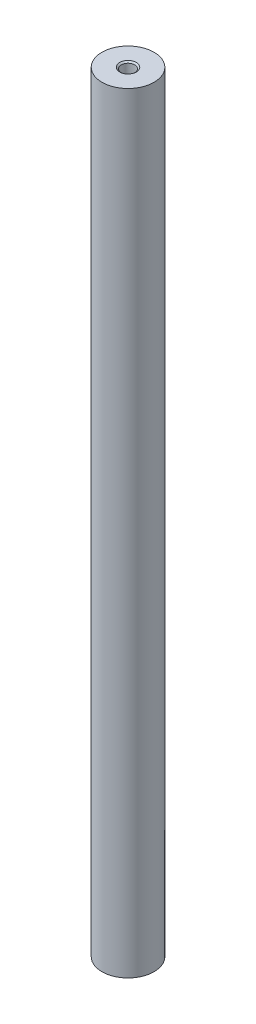
ISO-10303-21;
HEADER;
FILE_DESCRIPTION(('STEP AP214'),'2;1');
FILE_NAME('part.step','',(''),(''),'','','');
FILE_SCHEMA(('AUTOMOTIVE_DESIGN { 1 0 10303 214 1 1 1 1 }'));
ENDSEC;
DATA;
#1=APPLICATION_CONTEXT('core data for automotive mechanical design processes');
#2=APPLICATION_PROTOCOL_DEFINITION('international standard','automotive_design',2000,#1);
#3=PRODUCT_CONTEXT('',#1,'mechanical');
#4=PRODUCT('Part','Part','',(#3));
#5=PRODUCT_RELATED_PRODUCT_CATEGORY('part','',(#4));
#6=PRODUCT_DEFINITION_FORMATION('','',#4);
#7=PRODUCT_DEFINITION_CONTEXT('part definition',#1,'design');
#8=PRODUCT_DEFINITION('design','',#6,#7);
#9=PRODUCT_DEFINITION_SHAPE('','',#8);
#10=(LENGTH_UNIT() NAMED_UNIT(*) SI_UNIT(.MILLI.,.METRE.));
#11=(NAMED_UNIT(*) PLANE_ANGLE_UNIT() SI_UNIT($,.RADIAN.));
#12=(NAMED_UNIT(*) SI_UNIT($,.STERADIAN.) SOLID_ANGLE_UNIT());
#13=UNCERTAINTY_MEASURE_WITH_UNIT(LENGTH_MEASURE(1.E-05),#10,'distance_accuracy_value','');
#14=(GEOMETRIC_REPRESENTATION_CONTEXT(3) GLOBAL_UNCERTAINTY_ASSIGNED_CONTEXT((#13)) GLOBAL_UNIT_ASSIGNED_CONTEXT((#10,
#11,#12)) REPRESENTATION_CONTEXT('',''));
#15=CARTESIAN_POINT('',(0.,0.,0.));
#16=DIRECTION('',(0.,0.,1.));
#17=DIRECTION('',(1.,0.,0.));
#18=AXIS2_PLACEMENT_3D('',#15,#16,#17);
#19=CARTESIAN_POINT('',(0.,187.8203,0.));
#20=DIRECTION('',(0.,-1.,0.));
#21=DIRECTION('',(0.,0.,-1.));
#22=AXIS2_PLACEMENT_3D('',#19,#20,#21);
#23=CYLINDRICAL_SURFACE('',#22,6.35);
#24=CARTESIAN_POINT('',(0.,187.8203,0.));
#25=DIRECTION('',(0.,1.,0.));
#26=DIRECTION('',(0.,0.,1.));
#27=AXIS2_PLACEMENT_3D('',#24,#25,#26);
#28=CIRCLE('',#27,6.35);
#29=CARTESIAN_POINT('',(0.,187.8203,-6.35));
#30=VERTEX_POINT('',#29);
#31=EDGE_CURVE('E11',#30,#30,#28,.T.);
#32=CARTESIAN_POINT('',(0.,0.,0.));
#33=DIRECTION('',(0.,1.,0.));
#34=DIRECTION('',(0.,0.,1.));
#35=AXIS2_PLACEMENT_3D('',#32,#33,#34);
#36=CIRCLE('',#35,6.35);
#37=CARTESIAN_POINT('',(0.,0.,-6.35));
#38=VERTEX_POINT('',#37);
#39=EDGE_CURVE('E50',#38,#38,#36,.T.);
#40=CARTESIAN_POINT('',(0.,187.8203,-6.35));
#41=CARTESIAN_POINT('',(0.,185.863838541667,-6.35));
#42=CARTESIAN_POINT('',(0.,183.907377083333,-6.35));
#43=CARTESIAN_POINT('',(0.,179.994454166667,-6.35));
#44=CARTESIAN_POINT('',(0.,178.037992708333,-6.35));
#45=CARTESIAN_POINT('',(0.,174.125069791667,-6.35));
#46=CARTESIAN_POINT('',(0.,172.168608333333,-6.35));
#47=CARTESIAN_POINT('',(0.,168.255685416667,-6.35));
#48=CARTESIAN_POINT('',(0.,166.299223958333,-6.35));
#49=CARTESIAN_POINT('',(0.,162.386301041667,-6.35));
#50=CARTESIAN_POINT('',(0.,160.429839583333,-6.35));
#51=CARTESIAN_POINT('',(0.,156.516916666667,-6.35));
#52=CARTESIAN_POINT('',(0.,154.560455208333,-6.35));
#53=CARTESIAN_POINT('',(0.,150.647532291667,-6.35));
#54=CARTESIAN_POINT('',(0.,148.691070833333,-6.35));
#55=CARTESIAN_POINT('',(0.,144.778147916667,-6.35));
#56=CARTESIAN_POINT('',(0.,142.821686458333,-6.35));
#57=CARTESIAN_POINT('',(0.,138.908763541667,-6.35));
#58=CARTESIAN_POINT('',(0.,136.952302083333,-6.35));
#59=CARTESIAN_POINT('',(0.,133.039379166667,-6.35));
#60=CARTESIAN_POINT('',(0.,131.082917708333,-6.35));
#61=CARTESIAN_POINT('',(0.,127.169994791667,-6.35));
#62=CARTESIAN_POINT('',(0.,125.213533333333,-6.35));
#63=CARTESIAN_POINT('',(0.,121.300610416667,-6.35));
#64=CARTESIAN_POINT('',(0.,119.344148958333,-6.35));
#65=CARTESIAN_POINT('',(0.,115.431226041667,-6.35));
#66=CARTESIAN_POINT('',(0.,113.474764583333,-6.35));
#67=CARTESIAN_POINT('',(0.,109.561841666667,-6.35));
#68=CARTESIAN_POINT('',(0.,107.605380208333,-6.35));
#69=CARTESIAN_POINT('',(0.,103.692457291667,-6.35));
#70=CARTESIAN_POINT('',(0.,101.735995833333,-6.35));
#71=CARTESIAN_POINT('',(0.,97.8230729166666,-6.35));
#72=CARTESIAN_POINT('',(0.,95.8666114583333,-6.35));
#73=CARTESIAN_POINT('',(0.,91.9536885416667,-6.35));
#74=CARTESIAN_POINT('',(0.,89.9972270833333,-6.35));
#75=CARTESIAN_POINT('',(0.,86.0843041666667,-6.35));
#76=CARTESIAN_POINT('',(0.,84.1278427083333,-6.35));
#77=CARTESIAN_POINT('',(0.,80.2149197916666,-6.35));
#78=CARTESIAN_POINT('',(0.,78.2584583333333,-6.35));
#79=CARTESIAN_POINT('',(0.,74.3455354166666,-6.35));
#80=CARTESIAN_POINT('',(0.,72.3890739583333,-6.35));
#81=CARTESIAN_POINT('',(0.,68.4761510416666,-6.35));
#82=CARTESIAN_POINT('',(0.,66.5196895833333,-6.35));
#83=CARTESIAN_POINT('',(0.,62.6067666666666,-6.35));
#84=CARTESIAN_POINT('',(0.,60.6503052083333,-6.35));
#85=CARTESIAN_POINT('',(0.,56.7373822916666,-6.35));
#86=CARTESIAN_POINT('',(0.,54.7809208333333,-6.35));
#87=CARTESIAN_POINT('',(0.,50.8679979166666,-6.35));
#88=CARTESIAN_POINT('',(0.,48.9115364583333,-6.35));
#89=CARTESIAN_POINT('',(0.,44.9986135416666,-6.35));
#90=CARTESIAN_POINT('',(0.,43.0421520833333,-6.35));
#91=CARTESIAN_POINT('',(0.,39.1292291666666,-6.35));
#92=CARTESIAN_POINT('',(0.,37.1727677083333,-6.35));
#93=CARTESIAN_POINT('',(0.,33.2598447916666,-6.35));
#94=CARTESIAN_POINT('',(0.,31.3033833333333,-6.35));
#95=CARTESIAN_POINT('',(0.,27.3904604166667,-6.35));
#96=CARTESIAN_POINT('',(0.,25.4339989583333,-6.35));
#97=CARTESIAN_POINT('',(0.,21.5210760416666,-6.35));
#98=CARTESIAN_POINT('',(0.,19.5646145833333,-6.35));
#99=CARTESIAN_POINT('',(0.,15.6516916666666,-6.35));
#100=CARTESIAN_POINT('',(0.,13.6952302083333,-6.35));
#101=CARTESIAN_POINT('',(0.,9.78230729166663,-6.35));
#102=CARTESIAN_POINT('',(0.,7.82584583333331,-6.35));
#103=CARTESIAN_POINT('',(0.,3.91292291666664,-6.35));
#104=CARTESIAN_POINT('',(0.,1.95646145833331,-6.35));
#105=CARTESIAN_POINT('',(0.,0.,-6.35));
#106=B_SPLINE_CURVE_WITH_KNOTS('',3,(#40,#41,#42,#43,#44,#45,#46,#47,#48,#49,#50,#51,#52,#53,
#54,#55,#56,#57,#58,#59,#60,#61,#62,#63,#64,#65,#66,#67,#68,#69,#70,#71,#72,#73,#74,#75,#76,#77,
#78,#79,#80,#81,#82,#83,#84,#85,#86,#87,#88,#89,#90,#91,#92,#93,#94,#95,#96,#97,#98,#99,#100,
#101,#102,#103,#104,#105),.UNSPECIFIED.,.F.,.F.,(4,2,2,2,2,2,2,2,2,2,2,2,2,2,2,2,2,2,2,2,2,2,2,
2,2,2,2,2,2,2,2,2,4),(0.,5.86938437499998,11.73876875,17.608153125,23.4775375,29.346921875,
35.21630625,41.085690625,46.955075,52.824459375,58.69384375,64.563228125,70.4326125,
76.301996875,82.17138125,88.040765625,93.91015,99.779534375,105.64891875,111.518303125,
117.3876875,123.257071875,129.12645625,134.995840625,140.865225,146.734609375,152.60399375,
158.473378125,164.3427625,170.212146875,176.08153125,181.950915625,187.8203),.UNSPECIFIED.);
#107=EDGE_CURVE('BSEAM47',#30,#38,#106,.T.);
#108=ORIENTED_EDGE('',*,*,#31,.F.);
#109=ORIENTED_EDGE('',*,*,#39,.T.);
#110=ORIENTED_EDGE('',*,*,#107,.T.);
#111=ORIENTED_EDGE('',*,*,#107,.F.);
#112=EDGE_LOOP('',(#108,#110,#109,#111));
#113=FACE_BOUND('',#112,.T.);
#114=ADVANCED_FACE('F47',(#113),#23,.T.);
#115=CARTESIAN_POINT('',(0.,187.8203,0.));
#116=DIRECTION('',(0.,1.,0.));
#117=DIRECTION('',(0.,0.,1.));
#118=AXIS2_PLACEMENT_3D('',#115,#116,#117);
#119=PLANE('',#118);
#120=CARTESIAN_POINT('',(0.,187.8203,0.));
#121=DIRECTION('',(0.,1.,0.));
#122=DIRECTION('',(0.,0.,1.));
#123=AXIS2_PLACEMENT_3D('',#120,#121,#122);
#124=CIRCLE('',#123,2.025);
#125=CARTESIAN_POINT('',(0.,187.8203,2.025));
#126=VERTEX_POINT('',#125);
#127=EDGE_CURVE('E81',#126,#126,#124,.T.);
#128=ORIENTED_EDGE('',*,*,#127,.F.);
#129=EDGE_LOOP('',(#128));
#130=FACE_BOUND('',#129,.T.);
#131=ORIENTED_EDGE('',*,*,#31,.T.);
#132=EDGE_LOOP('',(#131));
#133=FACE_BOUND('',#132,.T.);
#134=ADVANCED_FACE('F101',(#130,#133),#119,.T.);
#135=CARTESIAN_POINT('',(0.,0.,0.));
#136=DIRECTION('',(0.,1.,0.));
#137=DIRECTION('',(0.,0.,1.));
#138=AXIS2_PLACEMENT_3D('',#135,#136,#137);
#139=PLANE('',#138);
#140=CARTESIAN_POINT('',(0.,0.,0.));
#141=DIRECTION('',(0.,-1.,0.));
#142=DIRECTION('',(0.,0.,-1.));
#143=AXIS2_PLACEMENT_3D('',#140,#141,#142);
#144=CIRCLE('',#143,3.81);
#145=CARTESIAN_POINT('',(0.,0.,-3.81));
#146=VERTEX_POINT('',#145);
#147=EDGE_CURVE('E72',#146,#146,#144,.T.);
#148=ORIENTED_EDGE('',*,*,#147,.F.);
#149=EDGE_LOOP('',(#148));
#150=FACE_BOUND('',#149,.T.);
#151=ORIENTED_EDGE('',*,*,#39,.F.);
#152=EDGE_LOOP('',(#151));
#153=FACE_BOUND('',#152,.T.);
#154=ADVANCED_FACE('F98',(#150,#153),#139,.F.);
#155=CARTESIAN_POINT('',(0.,21.59,0.));
#156=DIRECTION('',(0.,-1.,0.));
#157=DIRECTION('',(0.,0.,-1.));
#158=AXIS2_PLACEMENT_3D('',#155,#156,#157);
#159=CONICAL_SURFACE('',#158,2.55269999999999,1.02974425867665);
#160=CARTESIAN_POINT('',(0.,23.1238169021917,0.));
#161=VERTEX_POINT('',#160);
#162=VERTEX_LOOP('',#161);
#163=FACE_BOUND('',#162,.T.);
#164=CARTESIAN_POINT('',(0.,21.59,0.));
#165=DIRECTION('',(0.,-1.,0.));
#166=DIRECTION('',(0.,0.,-1.));
#167=AXIS2_PLACEMENT_3D('',#164,#165,#166);
#168=CIRCLE('',#167,2.55269999999999);
#169=CARTESIAN_POINT('',(0.,21.59,-2.55269999999999));
#170=VERTEX_POINT('',#169);
#171=EDGE_CURVE('E88',#170,#170,#168,.T.);
#172=ORIENTED_EDGE('',*,*,#171,.T.);
#173=EDGE_LOOP('',(#172));
#174=FACE_BOUND('',#173,.T.);
#175=ADVANCED_FACE('F100',(#163,#174),#159,.F.);
#176=CARTESIAN_POINT('',(0.,0.,0.));
#177=DIRECTION('',(0.,-1.,0.));
#178=DIRECTION('',(0.,0.,-1.));
#179=AXIS2_PLACEMENT_3D('',#176,#177,#178);
#180=CYLINDRICAL_SURFACE('',#179,2.5527);
#181=ORIENTED_EDGE('',*,*,#171,.F.);
#182=EDGE_LOOP('',(#181));
#183=FACE_BOUND('',#182,.T.);
#184=CARTESIAN_POINT('',(0.,1.05499996627919,0.));
#185=DIRECTION('',(0.,-1.,0.));
#186=DIRECTION('',(0.,0.,-1.));
#187=AXIS2_PLACEMENT_3D('',#184,#185,#186);
#188=CIRCLE('',#187,2.5527);
#189=CARTESIAN_POINT('',(0.,1.05499996627919,-2.5527));
#190=VERTEX_POINT('',#189);
#191=EDGE_CURVE('E78',#190,#190,#188,.T.);
#192=ORIENTED_EDGE('',*,*,#191,.T.);
#193=EDGE_LOOP('',(#192));
#194=FACE_BOUND('',#193,.T.);
#195=ADVANCED_FACE('F107',(#183,#194),#180,.F.);
#196=CARTESIAN_POINT('',(0.,0.,0.));
#197=DIRECTION('',(0.,-1.,0.));
#198=DIRECTION('',(0.,0.,-1.));
#199=AXIS2_PLACEMENT_3D('',#196,#197,#198);
#200=CONICAL_SURFACE('',#199,3.81,0.872664625997165);
#201=ORIENTED_EDGE('',*,*,#191,.F.);
#202=EDGE_LOOP('',(#201));
#203=FACE_BOUND('',#202,.T.);
#204=ORIENTED_EDGE('',*,*,#147,.T.);
#205=EDGE_LOOP('',(#204));
#206=FACE_BOUND('',#205,.T.);
#207=ADVANCED_FACE('F65',(#203,#206),#200,.F.);
#208=CARTESIAN_POINT('',(0.,170.0911,0.));
#209=DIRECTION('',(0.,1.,0.));
#210=DIRECTION('',(0.,0.,1.));
#211=AXIS2_PLACEMENT_3D('',#208,#209,#210);
#212=CONICAL_SURFACE('',#211,1.65,1.02974425867666);
#213=CARTESIAN_POINT('',(0.,169.099679978605,0.));
#214=VERTEX_POINT('',#213);
#215=VERTEX_LOOP('',#214);
#216=FACE_BOUND('',#215,.T.);
#217=CARTESIAN_POINT('',(0.,170.0911,0.));
#218=DIRECTION('',(0.,1.,0.));
#219=DIRECTION('',(0.,0.,1.));
#220=AXIS2_PLACEMENT_3D('',#217,#218,#219);
#221=CIRCLE('',#220,1.65);
#222=CARTESIAN_POINT('',(0.,170.0911,1.65));
#223=VERTEX_POINT('',#222);
#224=EDGE_CURVE('E69',#223,#223,#221,.T.);
#225=ORIENTED_EDGE('',*,*,#224,.T.);
#226=EDGE_LOOP('',(#225));
#227=FACE_BOUND('',#226,.T.);
#228=ADVANCED_FACE('F61',(#216,#227),#212,.F.);
#229=CARTESIAN_POINT('',(0.,187.8203,0.));
#230=DIRECTION('',(0.,1.,0.));
#231=DIRECTION('',(0.,0.,1.));
#232=AXIS2_PLACEMENT_3D('',#229,#230,#231);
#233=CYLINDRICAL_SURFACE('',#232,1.65);
#234=ORIENTED_EDGE('',*,*,#224,.F.);
#235=EDGE_LOOP('',(#234));
#236=FACE_BOUND('',#235,.T.);
#237=CARTESIAN_POINT('',(0.,187.505637638309,0.));
#238=DIRECTION('',(0.,1.,0.));
#239=DIRECTION('',(0.,0.,1.));
#240=AXIS2_PLACEMENT_3D('',#237,#238,#239);
#241=CIRCLE('',#240,1.65);
#242=CARTESIAN_POINT('',(0.,187.505637638309,1.65));
#243=VERTEX_POINT('',#242);
#244=EDGE_CURVE('E73',#243,#243,#241,.T.);
#245=ORIENTED_EDGE('',*,*,#244,.T.);
#246=EDGE_LOOP('',(#245));
#247=FACE_BOUND('',#246,.T.);
#248=ADVANCED_FACE('F64',(#236,#247),#233,.F.);
#249=CARTESIAN_POINT('',(0.,187.8203,0.));
#250=DIRECTION('',(0.,1.,0.));
#251=DIRECTION('',(0.,0.,1.));
#252=AXIS2_PLACEMENT_3D('',#249,#250,#251);
#253=CONICAL_SURFACE('',#252,2.025,0.872664625997173);
#254=ORIENTED_EDGE('',*,*,#244,.F.);
#255=EDGE_LOOP('',(#254));
#256=FACE_BOUND('',#255,.T.);
#257=ORIENTED_EDGE('',*,*,#127,.T.);
#258=EDGE_LOOP('',(#257));
#259=FACE_BOUND('',#258,.T.);
#260=ADVANCED_FACE('F146',(#256,#259),#253,.F.);
#261=CLOSED_SHELL('',(#114,#134,#154,#175,#195,#207,#228,#248,#260));
#262=MANIFOLD_SOLID_BREP('B2',#261);
#263=ADVANCED_BREP_SHAPE_REPRESENTATION('',(#18,#262),#14);
#264=SHAPE_DEFINITION_REPRESENTATION(#9,#263);
ENDSEC;
END-ISO-10303-21;
